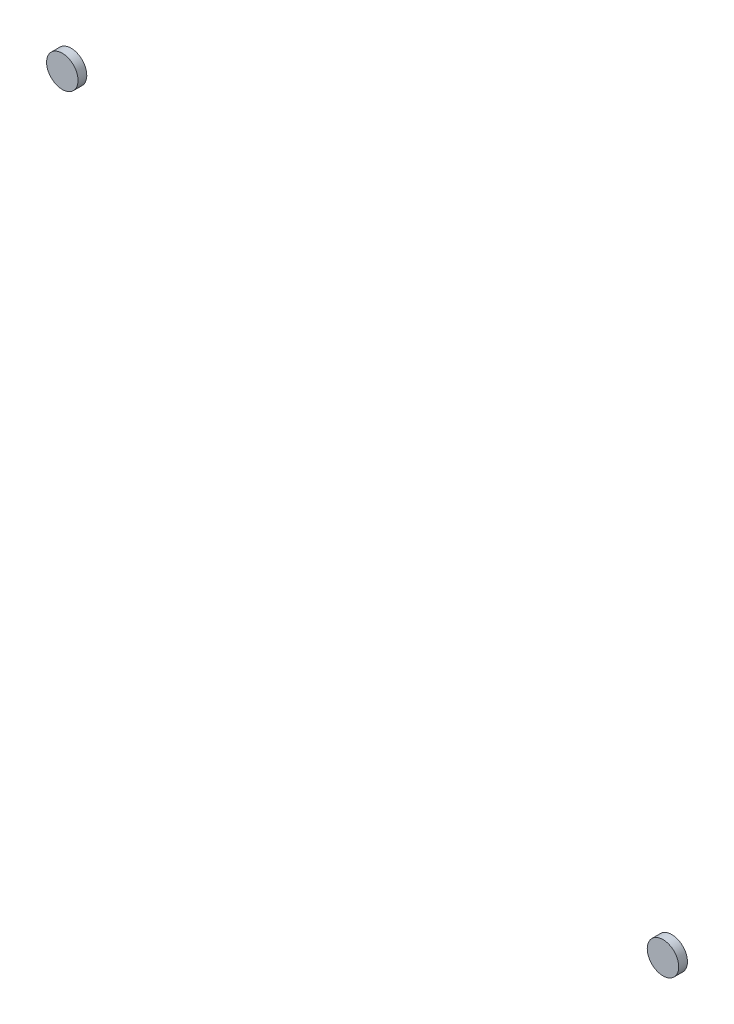
ISO-10303-21;
HEADER;
FILE_DESCRIPTION(('STEP AP214'),'2;1');
FILE_NAME('part.step','',(''),(''),'','','');
FILE_SCHEMA(('AUTOMOTIVE_DESIGN { 1 0 10303 214 1 1 1 1 }'));
ENDSEC;
DATA;
#1=APPLICATION_CONTEXT('core data for automotive mechanical design processes');
#2=APPLICATION_PROTOCOL_DEFINITION('international standard','automotive_design',2000,#1);
#3=PRODUCT_CONTEXT('',#1,'mechanical');
#4=PRODUCT('Part','Part','',(#3));
#5=PRODUCT_RELATED_PRODUCT_CATEGORY('part','',(#4));
#6=PRODUCT_DEFINITION_FORMATION('','',#4);
#7=PRODUCT_DEFINITION_CONTEXT('part definition',#1,'design');
#8=PRODUCT_DEFINITION('design','',#6,#7);
#9=PRODUCT_DEFINITION_SHAPE('','',#8);
#10=(LENGTH_UNIT() NAMED_UNIT(*) SI_UNIT(.MILLI.,.METRE.));
#11=(NAMED_UNIT(*) PLANE_ANGLE_UNIT() SI_UNIT($,.RADIAN.));
#12=(NAMED_UNIT(*) SI_UNIT($,.STERADIAN.) SOLID_ANGLE_UNIT());
#13=UNCERTAINTY_MEASURE_WITH_UNIT(LENGTH_MEASURE(1.E-05),#10,'distance_accuracy_value','');
#14=(GEOMETRIC_REPRESENTATION_CONTEXT(3) GLOBAL_UNCERTAINTY_ASSIGNED_CONTEXT((#13)) GLOBAL_UNIT_ASSIGNED_CONTEXT((#10,
#11,#12)) REPRESENTATION_CONTEXT('',''));
#15=CARTESIAN_POINT('',(0.,0.,0.));
#16=DIRECTION('',(0.,0.,1.));
#17=DIRECTION('',(1.,0.,0.));
#18=AXIS2_PLACEMENT_3D('',#15,#16,#17);
#19=CARTESIAN_POINT('',(4.84720519359977,19.9881677147825,-0.253998923289316));
#20=DIRECTION('',(0.,-8.74227339409095E-08,1.));
#21=DIRECTION('',(-1.19248806384999E-08,-1.,-8.74227339409095E-08));
#22=AXIS2_PLACEMENT_3D('',#19,#20,#21);
#23=PLANE('',#22);
#24=CARTESIAN_POINT('',(4.84720518814771,19.5309677147825,-0.253998963258991));
#25=DIRECTION('',(0.,8.74227339409095E-08,-1.));
#26=DIRECTION('',(1.19248806384999E-08,1.,8.74227339409095E-08));
#27=AXIS2_PLACEMENT_3D('',#24,#25,#26);
#28=CIRCLE('',#27,0.4572);
#29=CARTESIAN_POINT('',(4.84720519359977,19.9881677147825,-0.253998923289317));
#30=VERTEX_POINT('',#29);
#31=EDGE_CURVE('P0_E10',#30,#30,#28,.T.);
#32=ORIENTED_EDGE('',*,*,#31,.T.);
#33=EDGE_LOOP('',(#32));
#34=FACE_BOUND('',#33,.T.);
#35=ADVANCED_FACE('P0_F15',(#34),#23,.F.);
#36=CARTESIAN_POINT('',(4.84720519359977,19.9881676925772,1.07671068285201E-06));
#37=DIRECTION('',(0.,-8.74227339409095E-08,1.));
#38=DIRECTION('',(-1.19248806384999E-08,-1.,-8.74227339409095E-08));
#39=AXIS2_PLACEMENT_3D('',#36,#37,#38);
#40=PLANE('',#39);
#41=CARTESIAN_POINT('',(4.84720518814771,19.5309676925772,1.03674100901396E-06));
#42=DIRECTION('',(0.,8.74227339409095E-08,-1.));
#43=DIRECTION('',(1.19248806384999E-08,1.,8.74227339409095E-08));
#44=AXIS2_PLACEMENT_3D('',#41,#42,#43);
#45=CIRCLE('',#44,0.4572);
#46=CARTESIAN_POINT('',(4.84720519359977,19.9881676925772,1.07671068297175E-06));
#47=VERTEX_POINT('',#46);
#48=EDGE_CURVE('P0_E22',#47,#47,#45,.T.);
#49=ORIENTED_EDGE('',*,*,#48,.F.);
#50=EDGE_LOOP('',(#49));
#51=FACE_BOUND('',#50,.T.);
#52=ADVANCED_FACE('P0_F35',(#51),#40,.T.);
#53=CARTESIAN_POINT('',(4.84720518814771,19.5309676925772,1.03674100901396E-06));
#54=DIRECTION('',(0.,-8.74227339409095E-08,1.));
#55=DIRECTION('',(1.19248806384999E-08,1.,8.74227339409095E-08));
#56=AXIS2_PLACEMENT_3D('',#53,#54,#55);
#57=CYLINDRICAL_SURFACE('',#56,0.4572);
#58=ORIENTED_EDGE('',*,*,#31,.F.);
#59=EDGE_LOOP('',(#58));
#60=FACE_BOUND('',#59,.T.);
#61=ORIENTED_EDGE('',*,*,#48,.T.);
#62=EDGE_LOOP('',(#61));
#63=FACE_BOUND('',#62,.T.);
#64=ADVANCED_FACE('P0_F33',(#60,#63),#57,.T.);
#65=CLOSED_SHELL('',(#35,#52,#64));
#66=MANIFOLD_SOLID_BREP('P0_B1',#65);
#67=CARTESIAN_POINT('',(21.8400021363872,5.95597080651197,-0.253998963258981));
#68=DIRECTION('',(0.,-8.74227339409092E-08,1.));
#69=DIRECTION('',(1.,-8.74227765734792E-08,0.));
#70=AXIS2_PLACEMENT_3D('',#67,#68,#69);
#71=PLANE('',#70);
#72=CARTESIAN_POINT('',(22.2972021363873,5.95597076654228,-0.253998963258985));
#73=DIRECTION('',(0.,8.74227339409092E-08,-1.));
#74=DIRECTION('',(-1.,8.74227765734792E-08,0.));
#75=AXIS2_PLACEMENT_3D('',#72,#73,#74);
#76=CIRCLE('',#75,0.4572);
#77=CARTESIAN_POINT('',(21.8400021363872,5.95597080651197,-0.253998963258982));
#78=VERTEX_POINT('',#77);
#79=EDGE_CURVE('P1_E10',#78,#78,#76,.T.);
#80=ORIENTED_EDGE('',*,*,#79,.T.);
#81=EDGE_LOOP('',(#80));
#82=FACE_BOUND('',#81,.T.);
#83=ADVANCED_FACE('P1_F15',(#82),#71,.F.);
#84=CARTESIAN_POINT('',(21.8400021363872,5.9559707843066,1.0367410172539E-06));
#85=DIRECTION('',(0.,-8.74227339409092E-08,1.));
#86=DIRECTION('',(1.,-8.74227765734792E-08,0.));
#87=AXIS2_PLACEMENT_3D('',#84,#85,#86);
#88=PLANE('',#87);
#89=CARTESIAN_POINT('',(22.2972021363873,5.9559707443369,1.03674101378445E-06));
#90=DIRECTION('',(0.,8.74227339409092E-08,-1.));
#91=DIRECTION('',(-1.,8.74227765734792E-08,0.));
#92=AXIS2_PLACEMENT_3D('',#89,#90,#91);
#93=CIRCLE('',#92,0.4572);
#94=CARTESIAN_POINT('',(21.8400021363872,5.95597078430659,1.03674101727871E-06));
#95=VERTEX_POINT('',#94);
#96=EDGE_CURVE('P1_E22',#95,#95,#93,.T.);
#97=ORIENTED_EDGE('',*,*,#96,.F.);
#98=EDGE_LOOP('',(#97));
#99=FACE_BOUND('',#98,.T.);
#100=ADVANCED_FACE('P1_F35',(#99),#88,.T.);
#101=CARTESIAN_POINT('',(22.2972021363873,5.9559707443369,1.03674101378445E-06));
#102=DIRECTION('',(0.,-8.74227339409092E-08,1.));
#103=DIRECTION('',(-1.,8.74227765734792E-08,0.));
#104=AXIS2_PLACEMENT_3D('',#101,#102,#103);
#105=CYLINDRICAL_SURFACE('',#104,0.4572);
#106=ORIENTED_EDGE('',*,*,#79,.F.);
#107=EDGE_LOOP('',(#106));
#108=FACE_BOUND('',#107,.T.);
#109=ORIENTED_EDGE('',*,*,#96,.T.);
#110=EDGE_LOOP('',(#109));
#111=FACE_BOUND('',#110,.T.);
#112=ADVANCED_FACE('P1_F33',(#108,#111),#105,.T.);
#113=CLOSED_SHELL('',(#83,#100,#112));
#114=MANIFOLD_SOLID_BREP('P1_B1',#113);
#115=ADVANCED_BREP_SHAPE_REPRESENTATION('',(#18,#66,#114),#14);
#116=SHAPE_DEFINITION_REPRESENTATION(#9,#115);
ENDSEC;
END-ISO-10303-21;
